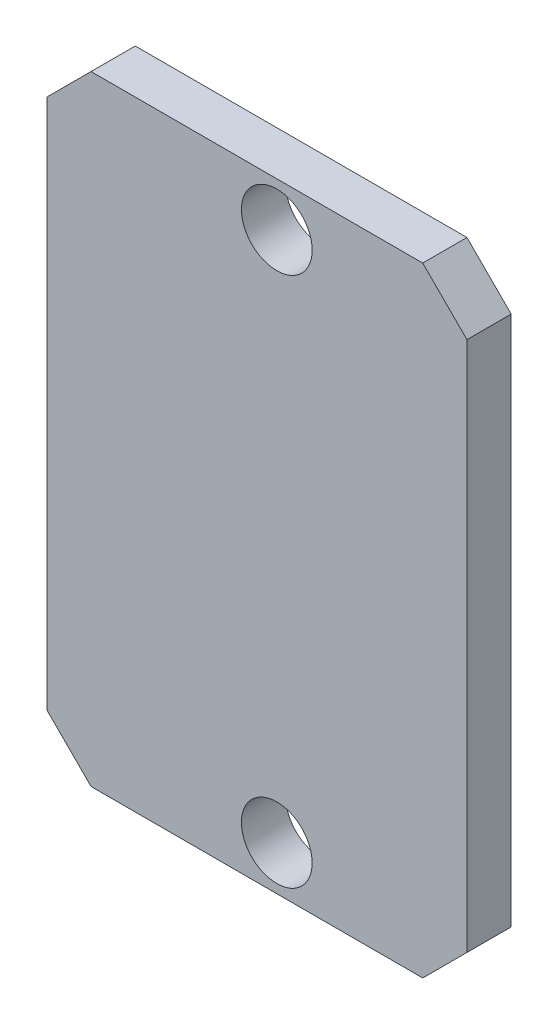
ISO-10303-21;
HEADER;
FILE_DESCRIPTION(('STEP AP214'),'2;1');
FILE_NAME('part.step','',(''),(''),'','','');
FILE_SCHEMA(('AUTOMOTIVE_DESIGN { 1 0 10303 214 1 1 1 1 }'));
ENDSEC;
DATA;
#1=APPLICATION_CONTEXT('core data for automotive mechanical design processes');
#2=APPLICATION_PROTOCOL_DEFINITION('international standard','automotive_design',2000,#1);
#3=PRODUCT_CONTEXT('',#1,'mechanical');
#4=PRODUCT('Part','Part','',(#3));
#5=PRODUCT_RELATED_PRODUCT_CATEGORY('part','',(#4));
#6=PRODUCT_DEFINITION_FORMATION('','',#4);
#7=PRODUCT_DEFINITION_CONTEXT('part definition',#1,'design');
#8=PRODUCT_DEFINITION('design','',#6,#7);
#9=PRODUCT_DEFINITION_SHAPE('','',#8);
#10=(LENGTH_UNIT() NAMED_UNIT(*) SI_UNIT(.MILLI.,.METRE.));
#11=(NAMED_UNIT(*) PLANE_ANGLE_UNIT() SI_UNIT($,.RADIAN.));
#12=(NAMED_UNIT(*) SI_UNIT($,.STERADIAN.) SOLID_ANGLE_UNIT());
#13=UNCERTAINTY_MEASURE_WITH_UNIT(LENGTH_MEASURE(1.E-05),#10,'distance_accuracy_value','');
#14=(GEOMETRIC_REPRESENTATION_CONTEXT(3) GLOBAL_UNCERTAINTY_ASSIGNED_CONTEXT((#13)) GLOBAL_UNIT_ASSIGNED_CONTEXT((#10,
#11,#12)) REPRESENTATION_CONTEXT('',''));
#15=CARTESIAN_POINT('',(0.,0.,0.));
#16=DIRECTION('',(0.,0.,1.));
#17=DIRECTION('',(1.,0.,0.));
#18=AXIS2_PLACEMENT_3D('',#15,#16,#17);
#19=CARTESIAN_POINT('',(0.,0.,2.));
#20=DIRECTION('',(0.,0.,-1.));
#21=DIRECTION('',(-1.,0.,0.));
#22=AXIS2_PLACEMENT_3D('',#19,#20,#21);
#23=PLANE('',#22);
#24=DIRECTION('',(-0.707106781186548,-0.707106781186547,0.));
#25=VECTOR('',#24,1.);
#26=CARTESIAN_POINT('',(0.,26.,2.));
#27=LINE('',#26,#25);
#28=CARTESIAN_POINT('',(2.,28.,2.));
#29=VERTEX_POINT('',#28);
#30=CARTESIAN_POINT('',(0.,26.,2.));
#31=VERTEX_POINT('',#30);
#32=EDGE_CURVE('E149',#29,#31,#27,.T.);
#33=ORIENTED_EDGE('',*,*,#32,.T.);
#34=DIRECTION('',(0.,-1.,0.));
#35=VECTOR('',#34,1.);
#36=CARTESIAN_POINT('',(0.,2.,2.));
#37=LINE('',#36,#35);
#38=CARTESIAN_POINT('',(0.,2.,2.));
#39=VERTEX_POINT('',#38);
#40=EDGE_CURVE('E97',#31,#39,#37,.T.);
#41=ORIENTED_EDGE('',*,*,#40,.T.);
#42=DIRECTION('',(0.707106781186548,-0.707106781186548,0.));
#43=VECTOR('',#42,1.);
#44=CARTESIAN_POINT('',(0.,2.,2.));
#45=LINE('',#44,#43);
#46=CARTESIAN_POINT('',(2.,0.,2.));
#47=VERTEX_POINT('',#46);
#48=EDGE_CURVE('E164',#39,#47,#45,.T.);
#49=ORIENTED_EDGE('',*,*,#48,.T.);
#50=DIRECTION('',(1.,0.,0.));
#51=VECTOR('',#50,1.);
#52=CARTESIAN_POINT('',(2.,0.,2.));
#53=LINE('',#52,#51);
#54=CARTESIAN_POINT('',(17.,0.,2.));
#55=VERTEX_POINT('',#54);
#56=EDGE_CURVE('E177',#47,#55,#53,.T.);
#57=ORIENTED_EDGE('',*,*,#56,.T.);
#58=DIRECTION('',(0.707106781186547,0.707106781186548,0.));
#59=VECTOR('',#58,1.);
#60=CARTESIAN_POINT('',(17.,0.,2.));
#61=LINE('',#60,#59);
#62=CARTESIAN_POINT('',(19.,2.,2.));
#63=VERTEX_POINT('',#62);
#64=EDGE_CURVE('E116',#55,#63,#61,.T.);
#65=ORIENTED_EDGE('',*,*,#64,.T.);
#66=DIRECTION('',(0.,1.,0.));
#67=VECTOR('',#66,1.);
#68=CARTESIAN_POINT('',(19.,2.,2.));
#69=LINE('',#68,#67);
#70=CARTESIAN_POINT('',(19.,26.,2.));
#71=VERTEX_POINT('',#70);
#72=EDGE_CURVE('E110',#63,#71,#69,.T.);
#73=ORIENTED_EDGE('',*,*,#72,.T.);
#74=DIRECTION('',(-0.707106781186548,0.707106781186548,0.));
#75=VECTOR('',#74,1.);
#76=CARTESIAN_POINT('',(17.,28.,2.));
#77=LINE('',#76,#75);
#78=CARTESIAN_POINT('',(17.,28.,2.));
#79=VERTEX_POINT('',#78);
#80=EDGE_CURVE('E114',#71,#79,#77,.T.);
#81=ORIENTED_EDGE('',*,*,#80,.T.);
#82=DIRECTION('',(-1.,0.,0.));
#83=VECTOR('',#82,1.);
#84=CARTESIAN_POINT('',(2.,28.,2.));
#85=LINE('',#84,#83);
#86=EDGE_CURVE('E54',#79,#29,#85,.T.);
#87=ORIENTED_EDGE('',*,*,#86,.T.);
#88=EDGE_LOOP('',(#33,#41,#49,#57,#65,#73,#81,#87));
#89=FACE_BOUND('',#88,.T.);
#90=CARTESIAN_POINT('',(10.4,26.,2.));
#91=DIRECTION('',(0.,0.,1.));
#92=DIRECTION('',(1.,0.,0.));
#93=AXIS2_PLACEMENT_3D('',#90,#91,#92);
#94=CIRCLE('',#93,1.6);
#95=CARTESIAN_POINT('',(12.,26.,2.));
#96=VERTEX_POINT('',#95);
#97=EDGE_CURVE('E138',#96,#96,#94,.T.);
#98=ORIENTED_EDGE('',*,*,#97,.F.);
#99=EDGE_LOOP('',(#98));
#100=FACE_BOUND('',#99,.T.);
#101=CARTESIAN_POINT('',(10.4,2.,2.));
#102=DIRECTION('',(0.,0.,1.));
#103=DIRECTION('',(-1.,0.,0.));
#104=AXIS2_PLACEMENT_3D('',#101,#102,#103);
#105=CIRCLE('',#104,1.6);
#106=CARTESIAN_POINT('',(8.8,2.,2.));
#107=VERTEX_POINT('',#106);
#108=EDGE_CURVE('E186',#107,#107,#105,.T.);
#109=ORIENTED_EDGE('',*,*,#108,.F.);
#110=EDGE_LOOP('',(#109));
#111=FACE_BOUND('',#110,.T.);
#112=ADVANCED_FACE('F37',(#89,#100,#111),#23,.F.);
#113=CARTESIAN_POINT('',(0.,0.,0.));
#114=DIRECTION('',(0.,0.,-1.));
#115=DIRECTION('',(-1.,0.,0.));
#116=AXIS2_PLACEMENT_3D('',#113,#114,#115);
#117=PLANE('',#116);
#118=CARTESIAN_POINT('',(10.4,26.,0.));
#119=DIRECTION('',(0.,0.,1.));
#120=DIRECTION('',(1.,0.,0.));
#121=AXIS2_PLACEMENT_3D('',#118,#119,#120);
#122=CIRCLE('',#121,1.6);
#123=CARTESIAN_POINT('',(12.,26.,0.));
#124=VERTEX_POINT('',#123);
#125=EDGE_CURVE('E183',#124,#124,#122,.T.);
#126=ORIENTED_EDGE('',*,*,#125,.T.);
#127=EDGE_LOOP('',(#126));
#128=FACE_BOUND('',#127,.T.);
#129=DIRECTION('',(-0.707106781186548,-0.707106781186547,0.));
#130=VECTOR('',#129,1.);
#131=CARTESIAN_POINT('',(0.,26.,0.));
#132=LINE('',#131,#130);
#133=CARTESIAN_POINT('',(2.,28.,0.));
#134=VERTEX_POINT('',#133);
#135=CARTESIAN_POINT('',(0.,26.,0.));
#136=VERTEX_POINT('',#135);
#137=EDGE_CURVE('E134',#134,#136,#132,.T.);
#138=ORIENTED_EDGE('',*,*,#137,.F.);
#139=DIRECTION('',(-1.,0.,0.));
#140=VECTOR('',#139,1.);
#141=CARTESIAN_POINT('',(2.,28.,0.));
#142=LINE('',#141,#140);
#143=CARTESIAN_POINT('',(17.,28.,0.));
#144=VERTEX_POINT('',#143);
#145=EDGE_CURVE('E89',#144,#134,#142,.T.);
#146=ORIENTED_EDGE('',*,*,#145,.F.);
#147=DIRECTION('',(-0.707106781186548,0.707106781186548,0.));
#148=VECTOR('',#147,1.);
#149=CARTESIAN_POINT('',(17.,28.,0.));
#150=LINE('',#149,#148);
#151=CARTESIAN_POINT('',(19.,26.,0.));
#152=VERTEX_POINT('',#151);
#153=EDGE_CURVE('E83',#152,#144,#150,.T.);
#154=ORIENTED_EDGE('',*,*,#153,.F.);
#155=DIRECTION('',(0.,1.,0.));
#156=VECTOR('',#155,1.);
#157=CARTESIAN_POINT('',(19.,2.,0.));
#158=LINE('',#157,#156);
#159=CARTESIAN_POINT('',(19.,2.,0.));
#160=VERTEX_POINT('',#159);
#161=EDGE_CURVE('E124',#160,#152,#158,.T.);
#162=ORIENTED_EDGE('',*,*,#161,.F.);
#163=DIRECTION('',(0.707106781186547,0.707106781186548,0.));
#164=VECTOR('',#163,1.);
#165=CARTESIAN_POINT('',(17.,0.,0.));
#166=LINE('',#165,#164);
#167=CARTESIAN_POINT('',(17.,0.,0.));
#168=VERTEX_POINT('',#167);
#169=EDGE_CURVE('E144',#168,#160,#166,.T.);
#170=ORIENTED_EDGE('',*,*,#169,.F.);
#171=DIRECTION('',(1.,0.,0.));
#172=VECTOR('',#171,1.);
#173=CARTESIAN_POINT('',(2.,0.,0.));
#174=LINE('',#173,#172);
#175=CARTESIAN_POINT('',(2.,0.,0.));
#176=VERTEX_POINT('',#175);
#177=EDGE_CURVE('E142',#176,#168,#174,.T.);
#178=ORIENTED_EDGE('',*,*,#177,.F.);
#179=DIRECTION('',(0.707106781186548,-0.707106781186548,0.));
#180=VECTOR('',#179,1.);
#181=CARTESIAN_POINT('',(0.,2.,0.));
#182=LINE('',#181,#180);
#183=CARTESIAN_POINT('',(0.,2.,0.));
#184=VERTEX_POINT('',#183);
#185=EDGE_CURVE('E140',#184,#176,#182,.T.);
#186=ORIENTED_EDGE('',*,*,#185,.F.);
#187=DIRECTION('',(0.,-1.,0.));
#188=VECTOR('',#187,1.);
#189=CARTESIAN_POINT('',(0.,2.,0.));
#190=LINE('',#189,#188);
#191=EDGE_CURVE('E137',#136,#184,#190,.T.);
#192=ORIENTED_EDGE('',*,*,#191,.F.);
#193=EDGE_LOOP('',(#138,#146,#154,#162,#170,#178,#186,#192));
#194=FACE_BOUND('',#193,.T.);
#195=CARTESIAN_POINT('',(10.4,2.,0.));
#196=DIRECTION('',(0.,0.,1.));
#197=DIRECTION('',(-1.,0.,0.));
#198=AXIS2_PLACEMENT_3D('',#195,#196,#197);
#199=CIRCLE('',#198,1.6);
#200=CARTESIAN_POINT('',(8.8,2.,0.));
#201=VERTEX_POINT('',#200);
#202=EDGE_CURVE('E189',#201,#201,#199,.T.);
#203=ORIENTED_EDGE('',*,*,#202,.T.);
#204=EDGE_LOOP('',(#203));
#205=FACE_BOUND('',#204,.T.);
#206=ADVANCED_FACE('F168',(#128,#194,#205),#117,.T.);
#207=CARTESIAN_POINT('',(0.,26.,2.));
#208=DIRECTION('',(0.707106781186547,-0.707106781186548,0.));
#209=DIRECTION('',(0.707106781186548,0.707106781186547,0.));
#210=AXIS2_PLACEMENT_3D('',#207,#208,#209);
#211=PLANE('',#210);
#212=ORIENTED_EDGE('',*,*,#137,.T.);
#213=DIRECTION('',(0.,0.,-1.));
#214=VECTOR('',#213,1.);
#215=CARTESIAN_POINT('',(0.,26.,2.));
#216=LINE('',#215,#214);
#217=EDGE_CURVE('E11',#31,#136,#216,.T.);
#218=ORIENTED_EDGE('',*,*,#217,.F.);
#219=ORIENTED_EDGE('',*,*,#32,.F.);
#220=DIRECTION('',(0.,0.,-1.));
#221=VECTOR('',#220,1.);
#222=CARTESIAN_POINT('',(2.,28.,2.));
#223=LINE('',#222,#221);
#224=EDGE_CURVE('E130',#29,#134,#223,.T.);
#225=ORIENTED_EDGE('',*,*,#224,.T.);
#226=EDGE_LOOP('',(#212,#218,#219,#225));
#227=FACE_BOUND('',#226,.T.);
#228=ADVANCED_FACE('F39',(#227),#211,.F.);
#229=CARTESIAN_POINT('',(0.,2.,2.));
#230=DIRECTION('',(1.,0.,0.));
#231=DIRECTION('',(0.,0.,-1.));
#232=AXIS2_PLACEMENT_3D('',#229,#230,#231);
#233=PLANE('',#232);
#234=ORIENTED_EDGE('',*,*,#191,.T.);
#235=DIRECTION('',(0.,0.,-1.));
#236=VECTOR('',#235,1.);
#237=CARTESIAN_POINT('',(0.,2.,2.));
#238=LINE('',#237,#236);
#239=EDGE_CURVE('E46',#39,#184,#238,.T.);
#240=ORIENTED_EDGE('',*,*,#239,.F.);
#241=ORIENTED_EDGE('',*,*,#40,.F.);
#242=ORIENTED_EDGE('',*,*,#217,.T.);
#243=EDGE_LOOP('',(#234,#240,#241,#242));
#244=FACE_BOUND('',#243,.T.);
#245=ADVANCED_FACE('F221',(#244),#233,.F.);
#246=CARTESIAN_POINT('',(0.,2.,2.));
#247=DIRECTION('',(0.707106781186547,0.707106781186547,0.));
#248=DIRECTION('',(-0.707106781186548,0.707106781186548,0.));
#249=AXIS2_PLACEMENT_3D('',#246,#247,#248);
#250=PLANE('',#249);
#251=ORIENTED_EDGE('',*,*,#185,.T.);
#252=DIRECTION('',(0.,0.,-1.));
#253=VECTOR('',#252,1.);
#254=CARTESIAN_POINT('',(2.,0.,2.));
#255=LINE('',#254,#253);
#256=EDGE_CURVE('E156',#47,#176,#255,.T.);
#257=ORIENTED_EDGE('',*,*,#256,.F.);
#258=ORIENTED_EDGE('',*,*,#48,.F.);
#259=ORIENTED_EDGE('',*,*,#239,.T.);
#260=EDGE_LOOP('',(#251,#257,#258,#259));
#261=FACE_BOUND('',#260,.T.);
#262=ADVANCED_FACE('F162',(#261),#250,.F.);
#263=CARTESIAN_POINT('',(2.,0.,2.));
#264=DIRECTION('',(0.,1.,0.));
#265=DIRECTION('',(-1.,0.,0.));
#266=AXIS2_PLACEMENT_3D('',#263,#264,#265);
#267=PLANE('',#266);
#268=ORIENTED_EDGE('',*,*,#177,.T.);
#269=DIRECTION('',(0.,0.,-1.));
#270=VECTOR('',#269,1.);
#271=CARTESIAN_POINT('',(17.,0.,2.));
#272=LINE('',#271,#270);
#273=EDGE_CURVE('E153',#55,#168,#272,.T.);
#274=ORIENTED_EDGE('',*,*,#273,.F.);
#275=ORIENTED_EDGE('',*,*,#56,.F.);
#276=ORIENTED_EDGE('',*,*,#256,.T.);
#277=EDGE_LOOP('',(#268,#274,#275,#276));
#278=FACE_BOUND('',#277,.T.);
#279=ADVANCED_FACE('F173',(#278),#267,.F.);
#280=CARTESIAN_POINT('',(17.,0.,2.));
#281=DIRECTION('',(-0.707106781186548,0.707106781186547,0.));
#282=DIRECTION('',(-0.707106781186547,-0.707106781186548,0.));
#283=AXIS2_PLACEMENT_3D('',#280,#281,#282);
#284=PLANE('',#283);
#285=ORIENTED_EDGE('',*,*,#169,.T.);
#286=DIRECTION('',(0.,0.,-1.));
#287=VECTOR('',#286,1.);
#288=CARTESIAN_POINT('',(19.,2.,2.));
#289=LINE('',#288,#287);
#290=EDGE_CURVE('E125',#63,#160,#289,.T.);
#291=ORIENTED_EDGE('',*,*,#290,.F.);
#292=ORIENTED_EDGE('',*,*,#64,.F.);
#293=ORIENTED_EDGE('',*,*,#273,.T.);
#294=EDGE_LOOP('',(#285,#291,#292,#293));
#295=FACE_BOUND('',#294,.T.);
#296=ADVANCED_FACE('F176',(#295),#284,.F.);
#297=CARTESIAN_POINT('',(19.,2.,2.));
#298=DIRECTION('',(-1.,0.,0.));
#299=DIRECTION('',(0.,0.,1.));
#300=AXIS2_PLACEMENT_3D('',#297,#298,#299);
#301=PLANE('',#300);
#302=ORIENTED_EDGE('',*,*,#161,.T.);
#303=DIRECTION('',(0.,0.,-1.));
#304=VECTOR('',#303,1.);
#305=CARTESIAN_POINT('',(19.,26.,2.));
#306=LINE('',#305,#304);
#307=EDGE_CURVE('E121',#71,#152,#306,.T.);
#308=ORIENTED_EDGE('',*,*,#307,.F.);
#309=ORIENTED_EDGE('',*,*,#72,.F.);
#310=ORIENTED_EDGE('',*,*,#290,.T.);
#311=EDGE_LOOP('',(#302,#308,#309,#310));
#312=FACE_BOUND('',#311,.T.);
#313=ADVANCED_FACE('F122',(#312),#301,.F.);
#314=CARTESIAN_POINT('',(17.,28.,2.));
#315=DIRECTION('',(-0.707106781186548,-0.707106781186548,0.));
#316=DIRECTION('',(0.707106781186548,-0.707106781186548,0.));
#317=AXIS2_PLACEMENT_3D('',#314,#315,#316);
#318=PLANE('',#317);
#319=ORIENTED_EDGE('',*,*,#153,.T.);
#320=DIRECTION('',(0.,0.,-1.));
#321=VECTOR('',#320,1.);
#322=CARTESIAN_POINT('',(17.,28.,2.));
#323=LINE('',#322,#321);
#324=EDGE_CURVE('E126',#79,#144,#323,.T.);
#325=ORIENTED_EDGE('',*,*,#324,.F.);
#326=ORIENTED_EDGE('',*,*,#80,.F.);
#327=ORIENTED_EDGE('',*,*,#307,.T.);
#328=EDGE_LOOP('',(#319,#325,#326,#327));
#329=FACE_BOUND('',#328,.T.);
#330=ADVANCED_FACE('F128',(#329),#318,.F.);
#331=CARTESIAN_POINT('',(2.,28.,2.));
#332=DIRECTION('',(0.,-1.,0.));
#333=DIRECTION('',(1.,0.,0.));
#334=AXIS2_PLACEMENT_3D('',#331,#332,#333);
#335=PLANE('',#334);
#336=ORIENTED_EDGE('',*,*,#145,.T.);
#337=ORIENTED_EDGE('',*,*,#224,.F.);
#338=ORIENTED_EDGE('',*,*,#86,.F.);
#339=ORIENTED_EDGE('',*,*,#324,.T.);
#340=EDGE_LOOP('',(#336,#337,#338,#339));
#341=FACE_BOUND('',#340,.T.);
#342=ADVANCED_FACE('F209',(#341),#335,.F.);
#343=CARTESIAN_POINT('',(10.4,26.,2.));
#344=DIRECTION('',(0.,0.,-1.));
#345=DIRECTION('',(-1.,0.,0.));
#346=AXIS2_PLACEMENT_3D('',#343,#344,#345);
#347=CYLINDRICAL_SURFACE('',#346,1.6);
#348=ORIENTED_EDGE('',*,*,#97,.T.);
#349=EDGE_LOOP('',(#348));
#350=FACE_BOUND('',#349,.T.);
#351=ORIENTED_EDGE('',*,*,#125,.F.);
#352=EDGE_LOOP('',(#351));
#353=FACE_BOUND('',#352,.T.);
#354=ADVANCED_FACE('F206',(#350,#353),#347,.F.);
#355=CARTESIAN_POINT('',(10.4,2.,2.));
#356=DIRECTION('',(0.,0.,-1.));
#357=DIRECTION('',(-1.,0.,0.));
#358=AXIS2_PLACEMENT_3D('',#355,#356,#357);
#359=CYLINDRICAL_SURFACE('',#358,1.6);
#360=ORIENTED_EDGE('',*,*,#108,.T.);
#361=EDGE_LOOP('',(#360));
#362=FACE_BOUND('',#361,.T.);
#363=ORIENTED_EDGE('',*,*,#202,.F.);
#364=EDGE_LOOP('',(#363));
#365=FACE_BOUND('',#364,.T.);
#366=ADVANCED_FACE('F195',(#362,#365),#359,.F.);
#367=CLOSED_SHELL('',(#112,#206,#228,#245,#262,#279,#296,#313,#330,#342,#354,#366));
#368=MANIFOLD_SOLID_BREP('B2',#367);
#369=ADVANCED_BREP_SHAPE_REPRESENTATION('',(#18,#368),#14);
#370=SHAPE_DEFINITION_REPRESENTATION(#9,#369);
ENDSEC;
END-ISO-10303-21;
